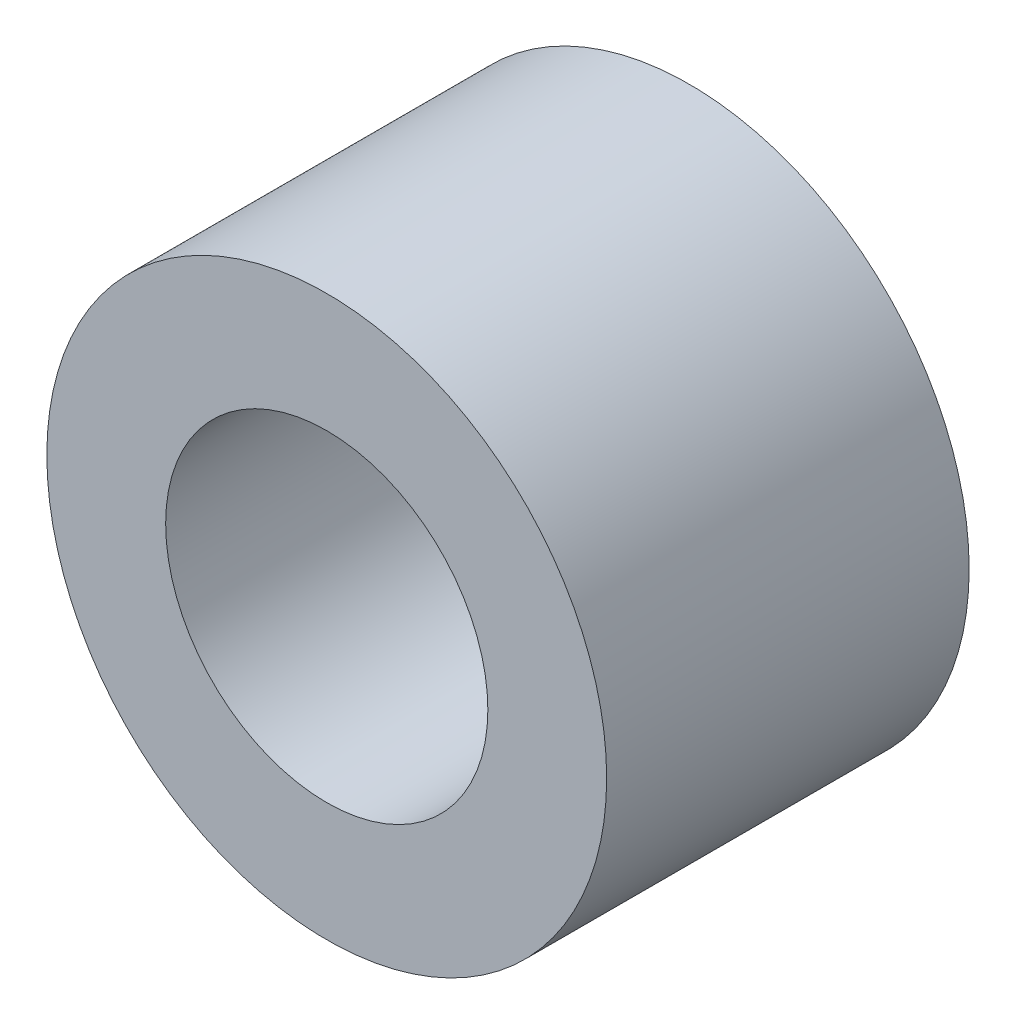
ISO-10303-21;
HEADER;
FILE_DESCRIPTION(('STEP AP214'),'2;1');
FILE_NAME('part.step','',(''),(''),'','','');
FILE_SCHEMA(('AUTOMOTIVE_DESIGN { 1 0 10303 214 1 1 1 1 }'));
ENDSEC;
DATA;
#1=APPLICATION_CONTEXT('core data for automotive mechanical design processes');
#2=APPLICATION_PROTOCOL_DEFINITION('international standard','automotive_design',2000,#1);
#3=PRODUCT_CONTEXT('',#1,'mechanical');
#4=PRODUCT('Part','Part','',(#3));
#5=PRODUCT_RELATED_PRODUCT_CATEGORY('part','',(#4));
#6=PRODUCT_DEFINITION_FORMATION('','',#4);
#7=PRODUCT_DEFINITION_CONTEXT('part definition',#1,'design');
#8=PRODUCT_DEFINITION('design','',#6,#7);
#9=PRODUCT_DEFINITION_SHAPE('','',#8);
#10=(LENGTH_UNIT() NAMED_UNIT(*) SI_UNIT(.MILLI.,.METRE.));
#11=(NAMED_UNIT(*) PLANE_ANGLE_UNIT() SI_UNIT($,.RADIAN.));
#12=(NAMED_UNIT(*) SI_UNIT($,.STERADIAN.) SOLID_ANGLE_UNIT());
#13=UNCERTAINTY_MEASURE_WITH_UNIT(LENGTH_MEASURE(1.E-05),#10,'distance_accuracy_value','');
#14=(GEOMETRIC_REPRESENTATION_CONTEXT(3) GLOBAL_UNCERTAINTY_ASSIGNED_CONTEXT((#13)) GLOBAL_UNIT_ASSIGNED_CONTEXT((#10,
#11,#12)) REPRESENTATION_CONTEXT('',''));
#15=CARTESIAN_POINT('',(0.,0.,0.));
#16=DIRECTION('',(0.,0.,1.));
#17=DIRECTION('',(1.,0.,0.));
#18=AXIS2_PLACEMENT_3D('',#15,#16,#17);
#19=CARTESIAN_POINT('',(0.,0.,4.5));
#20=DIRECTION('',(0.,0.,1.));
#21=DIRECTION('',(1.,0.,0.));
#22=AXIS2_PLACEMENT_3D('',#19,#20,#21);
#23=PLANE('',#22);
#24=CARTESIAN_POINT('',(0.,0.,4.5));
#25=DIRECTION('',(0.,0.,1.));
#26=DIRECTION('',(1.,0.,0.));
#27=AXIS2_PLACEMENT_3D('',#24,#25,#26);
#28=CIRCLE('',#27,3.475);
#29=CARTESIAN_POINT('',(3.475,0.,4.5));
#30=VERTEX_POINT('',#29);
#31=EDGE_CURVE('E10',#30,#30,#28,.T.);
#32=ORIENTED_EDGE('',*,*,#31,.T.);
#33=EDGE_LOOP('',(#32));
#34=FACE_BOUND('',#33,.T.);
#35=CARTESIAN_POINT('',(0.,0.,4.5));
#36=DIRECTION('',(0.,0.,1.));
#37=DIRECTION('',(1.,0.,0.));
#38=AXIS2_PLACEMENT_3D('',#35,#36,#37);
#39=CIRCLE('',#38,2.);
#40=CARTESIAN_POINT('',(2.,0.,4.5));
#41=VERTEX_POINT('',#40);
#42=EDGE_CURVE('E41',#41,#41,#39,.T.);
#43=ORIENTED_EDGE('',*,*,#42,.F.);
#44=EDGE_LOOP('',(#43));
#45=FACE_BOUND('',#44,.T.);
#46=ADVANCED_FACE('F30',(#34,#45),#23,.T.);
#47=CARTESIAN_POINT('',(0.,0.,0.));
#48=DIRECTION('',(0.,0.,1.));
#49=DIRECTION('',(1.,0.,0.));
#50=AXIS2_PLACEMENT_3D('',#47,#48,#49);
#51=PLANE('',#50);
#52=CARTESIAN_POINT('',(0.,0.,0.));
#53=DIRECTION('',(0.,0.,1.));
#54=DIRECTION('',(1.,0.,0.));
#55=AXIS2_PLACEMENT_3D('',#52,#53,#54);
#56=CIRCLE('',#55,3.475);
#57=CARTESIAN_POINT('',(3.475,0.,0.));
#58=VERTEX_POINT('',#57);
#59=EDGE_CURVE('E34',#58,#58,#56,.T.);
#60=ORIENTED_EDGE('',*,*,#59,.F.);
#61=EDGE_LOOP('',(#60));
#62=FACE_BOUND('',#61,.T.);
#63=CARTESIAN_POINT('',(0.,0.,0.));
#64=DIRECTION('',(0.,0.,1.));
#65=DIRECTION('',(1.,0.,0.));
#66=AXIS2_PLACEMENT_3D('',#63,#64,#65);
#67=CIRCLE('',#66,2.);
#68=CARTESIAN_POINT('',(2.,0.,0.));
#69=VERTEX_POINT('',#68);
#70=EDGE_CURVE('E43',#69,#69,#67,.T.);
#71=ORIENTED_EDGE('',*,*,#70,.T.);
#72=EDGE_LOOP('',(#71));
#73=FACE_BOUND('',#72,.T.);
#74=ADVANCED_FACE('F53',(#62,#73),#51,.F.);
#75=CARTESIAN_POINT('',(0.,0.,4.5));
#76=DIRECTION('',(0.,0.,-1.));
#77=DIRECTION('',(-1.,0.,0.));
#78=AXIS2_PLACEMENT_3D('',#75,#76,#77);
#79=CYLINDRICAL_SURFACE('',#78,3.475);
#80=ORIENTED_EDGE('',*,*,#31,.F.);
#81=EDGE_LOOP('',(#80));
#82=FACE_BOUND('',#81,.T.);
#83=ORIENTED_EDGE('',*,*,#59,.T.);
#84=EDGE_LOOP('',(#83));
#85=FACE_BOUND('',#84,.T.);
#86=ADVANCED_FACE('F32',(#82,#85),#79,.T.);
#87=CARTESIAN_POINT('',(0.,0.,4.5));
#88=DIRECTION('',(0.,0.,-1.));
#89=DIRECTION('',(-1.,0.,0.));
#90=AXIS2_PLACEMENT_3D('',#87,#88,#89);
#91=CYLINDRICAL_SURFACE('',#90,2.);
#92=ORIENTED_EDGE('',*,*,#42,.T.);
#93=EDGE_LOOP('',(#92));
#94=FACE_BOUND('',#93,.T.);
#95=ORIENTED_EDGE('',*,*,#70,.F.);
#96=EDGE_LOOP('',(#95));
#97=FACE_BOUND('',#96,.T.);
#98=ADVANCED_FACE('F49',(#94,#97),#91,.F.);
#99=CLOSED_SHELL('',(#46,#74,#86,#98));
#100=MANIFOLD_SOLID_BREP('B2',#99);
#101=ADVANCED_BREP_SHAPE_REPRESENTATION('',(#18,#100),#14);
#102=SHAPE_DEFINITION_REPRESENTATION(#9,#101);
ENDSEC;
END-ISO-10303-21;
